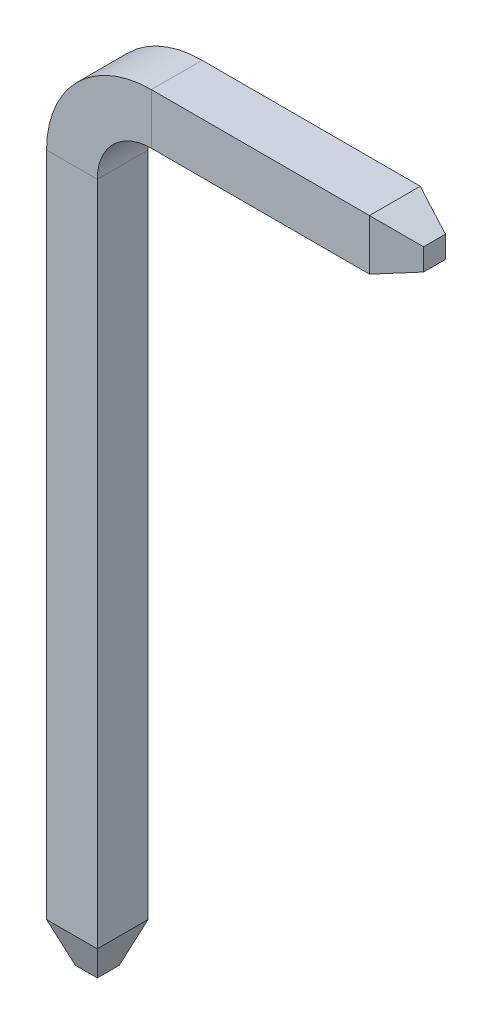
ISO-10303-21;
HEADER;
FILE_DESCRIPTION(('STEP AP214'),'2;1');
FILE_NAME('part.step','',(''),(''),'','','');
FILE_SCHEMA(('AUTOMOTIVE_DESIGN { 1 0 10303 214 1 1 1 1 }'));
ENDSEC;
DATA;
#1=APPLICATION_CONTEXT('core data for automotive mechanical design processes');
#2=APPLICATION_PROTOCOL_DEFINITION('international standard','automotive_design',2000,#1);
#3=PRODUCT_CONTEXT('',#1,'mechanical');
#4=PRODUCT('Part','Part','',(#3));
#5=PRODUCT_RELATED_PRODUCT_CATEGORY('part','',(#4));
#6=PRODUCT_DEFINITION_FORMATION('','',#4);
#7=PRODUCT_DEFINITION_CONTEXT('part definition',#1,'design');
#8=PRODUCT_DEFINITION('design','',#6,#7);
#9=PRODUCT_DEFINITION_SHAPE('','',#8);
#10=(LENGTH_UNIT() NAMED_UNIT(*) SI_UNIT(.MILLI.,.METRE.));
#11=(NAMED_UNIT(*) PLANE_ANGLE_UNIT() SI_UNIT($,.RADIAN.));
#12=(NAMED_UNIT(*) SI_UNIT($,.STERADIAN.) SOLID_ANGLE_UNIT());
#13=UNCERTAINTY_MEASURE_WITH_UNIT(LENGTH_MEASURE(1.E-05),#10,'distance_accuracy_value','');
#14=(GEOMETRIC_REPRESENTATION_CONTEXT(3) GLOBAL_UNCERTAINTY_ASSIGNED_CONTEXT((#13)) GLOBAL_UNIT_ASSIGNED_CONTEXT((#10,
#11,#12)) REPRESENTATION_CONTEXT('',''));
#15=CARTESIAN_POINT('',(0.,0.,0.));
#16=DIRECTION('',(0.,0.,1.));
#17=DIRECTION('',(1.,0.,0.));
#18=AXIS2_PLACEMENT_3D('',#15,#16,#17);
#19=CARTESIAN_POINT('',(0.,-7.25,0.));
#20=DIRECTION('',(0.,1.,0.));
#21=DIRECTION('',(0.,0.,1.));
#22=AXIS2_PLACEMENT_3D('',#19,#20,#21);
#23=PLANE('',#22);
#24=DIRECTION('',(0.,0.,-1.));
#25=VECTOR('',#24,1.);
#26=CARTESIAN_POINT('',(-0.138014882866899,-7.25,-0.32));
#27=LINE('',#26,#25);
#28=CARTESIAN_POINT('',(-0.138014882866899,-7.25,0.1380148828669));
#29=VERTEX_POINT('',#28);
#30=CARTESIAN_POINT('',(-0.138014882866899,-7.25,-0.1380148828669));
#31=VERTEX_POINT('',#30);
#32=EDGE_CURVE('E232',#29,#31,#27,.T.);
#33=ORIENTED_EDGE('',*,*,#32,.T.);
#34=DIRECTION('',(1.,0.,0.));
#35=VECTOR('',#34,1.);
#36=CARTESIAN_POINT('',(0.320000000000001,-7.25,-0.1380148828669));
#37=LINE('',#36,#35);
#38=CARTESIAN_POINT('',(0.138014882866901,-7.25,-0.1380148828669));
#39=VERTEX_POINT('',#38);
#40=EDGE_CURVE('E234',#31,#39,#37,.T.);
#41=ORIENTED_EDGE('',*,*,#40,.T.);
#42=DIRECTION('',(0.,0.,1.));
#43=VECTOR('',#42,1.);
#44=CARTESIAN_POINT('',(0.138014882866901,-7.25,0.32));
#45=LINE('',#44,#43);
#46=CARTESIAN_POINT('',(0.138014882866901,-7.25,0.1380148828669));
#47=VERTEX_POINT('',#46);
#48=EDGE_CURVE('E228',#39,#47,#45,.T.);
#49=ORIENTED_EDGE('',*,*,#48,.T.);
#50=DIRECTION('',(-1.,0.,0.));
#51=VECTOR('',#50,1.);
#52=CARTESIAN_POINT('',(-0.319999999999999,-7.25,0.1380148828669));
#53=LINE('',#52,#51);
#54=EDGE_CURVE('E230',#47,#29,#53,.T.);
#55=ORIENTED_EDGE('',*,*,#54,.T.);
#56=EDGE_LOOP('',(#33,#41,#49,#55));
#57=FACE_BOUND('',#56,.T.);
#58=ADVANCED_FACE('F36',(#57),#23,.F.);
#59=CARTESIAN_POINT('',(4.25,2.65,0.));
#60=DIRECTION('',(1.,0.,0.));
#61=DIRECTION('',(0.,0.,1.));
#62=AXIS2_PLACEMENT_3D('',#59,#60,#61);
#63=PLANE('',#62);
#64=DIRECTION('',(0.,0.,1.));
#65=VECTOR('',#64,1.);
#66=CARTESIAN_POINT('',(4.25,2.7880148828669,0.));
#67=LINE('',#66,#65);
#68=CARTESIAN_POINT('',(4.25,2.7880148828669,-0.1380148828669));
#69=VERTEX_POINT('',#68);
#70=CARTESIAN_POINT('',(4.25,2.7880148828669,0.1380148828669));
#71=VERTEX_POINT('',#70);
#72=EDGE_CURVE('E204',#69,#71,#67,.T.);
#73=ORIENTED_EDGE('',*,*,#72,.T.);
#74=DIRECTION('',(0.,-1.,0.));
#75=VECTOR('',#74,1.);
#76=CARTESIAN_POINT('',(4.25,2.65,0.1380148828669));
#77=LINE('',#76,#75);
#78=CARTESIAN_POINT('',(4.25,2.5119851171331,0.1380148828669));
#79=VERTEX_POINT('',#78);
#80=EDGE_CURVE('E206',#71,#79,#77,.T.);
#81=ORIENTED_EDGE('',*,*,#80,.T.);
#82=DIRECTION('',(0.,0.,-1.));
#83=VECTOR('',#82,1.);
#84=CARTESIAN_POINT('',(4.25,2.5119851171331,0.));
#85=LINE('',#84,#83);
#86=CARTESIAN_POINT('',(4.25,2.5119851171331,-0.1380148828669));
#87=VERTEX_POINT('',#86);
#88=EDGE_CURVE('E197',#79,#87,#85,.T.);
#89=ORIENTED_EDGE('',*,*,#88,.T.);
#90=DIRECTION('',(0.,1.,0.));
#91=VECTOR('',#90,1.);
#92=CARTESIAN_POINT('',(4.25,2.65,-0.1380148828669));
#93=LINE('',#92,#91);
#94=EDGE_CURVE('E202',#87,#69,#93,.T.);
#95=ORIENTED_EDGE('',*,*,#94,.T.);
#96=EDGE_LOOP('',(#73,#81,#89,#95));
#97=FACE_BOUND('',#96,.T.);
#98=ADVANCED_FACE('F289',(#97),#63,.T.);
#99=CARTESIAN_POINT('',(-0.319999999999999,-7.25,-0.32));
#100=DIRECTION('',(-1.,0.,0.));
#101=DIRECTION('',(0.,-1.,0.));
#102=AXIS2_PLACEMENT_3D('',#99,#100,#101);
#103=PLANE('',#102);
#104=DIRECTION('',(0.,1.,0.));
#105=VECTOR('',#104,1.);
#106=CARTESIAN_POINT('',(-0.319999999999999,-7.25,-0.32));
#107=LINE('',#106,#105);
#108=CARTESIAN_POINT('',(-0.319999999999999,-6.75,-0.32));
#109=VERTEX_POINT('',#108);
#110=CARTESIAN_POINT('',(-0.32,1.64999999999999,-0.32));
#111=VERTEX_POINT('',#110);
#112=EDGE_CURVE('E127',#109,#111,#107,.T.);
#113=ORIENTED_EDGE('',*,*,#112,.F.);
#114=DIRECTION('',(0.,0.,1.));
#115=VECTOR('',#114,1.);
#116=CARTESIAN_POINT('',(-0.319999999999999,-6.75,0.32));
#117=LINE('',#116,#115);
#118=CARTESIAN_POINT('',(-0.319999999999999,-6.75,0.32));
#119=VERTEX_POINT('',#118);
#120=EDGE_CURVE('E61',#109,#119,#117,.T.);
#121=ORIENTED_EDGE('',*,*,#120,.T.);
#122=DIRECTION('',(0.,1.,0.));
#123=VECTOR('',#122,1.);
#124=CARTESIAN_POINT('',(-0.319999999999999,-7.25,0.32));
#125=LINE('',#124,#123);
#126=CARTESIAN_POINT('',(-0.32,1.64999999999999,0.32));
#127=VERTEX_POINT('',#126);
#128=EDGE_CURVE('E137',#119,#127,#125,.T.);
#129=ORIENTED_EDGE('',*,*,#128,.T.);
#130=DIRECTION('',(0.,0.,1.));
#131=VECTOR('',#130,1.);
#132=CARTESIAN_POINT('',(-0.32,1.64999999999999,-0.32));
#133=LINE('',#132,#131);
#134=EDGE_CURVE('E147',#111,#127,#133,.T.);
#135=ORIENTED_EDGE('',*,*,#134,.F.);
#136=EDGE_LOOP('',(#113,#121,#129,#135));
#137=FACE_BOUND('',#136,.T.);
#138=ADVANCED_FACE('F159',(#137),#103,.T.);
#139=CARTESIAN_POINT('',(-0.319999999999999,-7.25,0.32));
#140=DIRECTION('',(0.,0.,1.));
#141=DIRECTION('',(1.,0.,0.));
#142=AXIS2_PLACEMENT_3D('',#139,#140,#141);
#143=PLANE('',#142);
#144=ORIENTED_EDGE('',*,*,#128,.F.);
#145=DIRECTION('',(1.,0.,0.));
#146=VECTOR('',#145,1.);
#147=CARTESIAN_POINT('',(0.320000000000001,-6.75,0.32));
#148=LINE('',#147,#146);
#149=CARTESIAN_POINT('',(0.320000000000001,-6.75,0.32));
#150=VERTEX_POINT('',#149);
#151=EDGE_CURVE('E46',#119,#150,#148,.T.);
#152=ORIENTED_EDGE('',*,*,#151,.T.);
#153=DIRECTION('',(0.,1.,0.));
#154=VECTOR('',#153,1.);
#155=CARTESIAN_POINT('',(0.320000000000001,-7.25,0.32));
#156=LINE('',#155,#154);
#157=CARTESIAN_POINT('',(0.32,1.64999999999999,0.32));
#158=VERTEX_POINT('',#157);
#159=EDGE_CURVE('E166',#150,#158,#156,.T.);
#160=ORIENTED_EDGE('',*,*,#159,.T.);
#161=DIRECTION('',(1.,0.,0.));
#162=VECTOR('',#161,1.);
#163=CARTESIAN_POINT('',(-0.32,1.64999999999999,0.32));
#164=LINE('',#163,#162);
#165=EDGE_CURVE('E161',#127,#158,#164,.T.);
#166=ORIENTED_EDGE('',*,*,#165,.F.);
#167=EDGE_LOOP('',(#144,#152,#160,#166));
#168=FACE_BOUND('',#167,.T.);
#169=ADVANCED_FACE('F360',(#168),#143,.T.);
#170=CARTESIAN_POINT('',(0.320000000000001,-7.25,-0.32));
#171=DIRECTION('',(1.,0.,0.));
#172=DIRECTION('',(0.,1.,0.));
#173=AXIS2_PLACEMENT_3D('',#170,#171,#172);
#174=PLANE('',#173);
#175=ORIENTED_EDGE('',*,*,#159,.F.);
#176=DIRECTION('',(0.,0.,-1.));
#177=VECTOR('',#176,1.);
#178=CARTESIAN_POINT('',(0.320000000000001,-6.75,-0.32));
#179=LINE('',#178,#177);
#180=CARTESIAN_POINT('',(0.320000000000001,-6.75,-0.32));
#181=VERTEX_POINT('',#180);
#182=EDGE_CURVE('E11',#150,#181,#179,.T.);
#183=ORIENTED_EDGE('',*,*,#182,.T.);
#184=DIRECTION('',(0.,1.,0.));
#185=VECTOR('',#184,1.);
#186=CARTESIAN_POINT('',(0.320000000000001,-7.25,-0.32));
#187=LINE('',#186,#185);
#188=CARTESIAN_POINT('',(0.32,1.64999999999999,-0.32));
#189=VERTEX_POINT('',#188);
#190=EDGE_CURVE('E162',#181,#189,#187,.T.);
#191=ORIENTED_EDGE('',*,*,#190,.T.);
#192=DIRECTION('',(0.,0.,-1.));
#193=VECTOR('',#192,1.);
#194=CARTESIAN_POINT('',(0.32,1.64999999999999,-0.32));
#195=LINE('',#194,#193);
#196=EDGE_CURVE('E157',#158,#189,#195,.T.);
#197=ORIENTED_EDGE('',*,*,#196,.F.);
#198=EDGE_LOOP('',(#175,#183,#191,#197));
#199=FACE_BOUND('',#198,.T.);
#200=ADVANCED_FACE('F363',(#199),#174,.T.);
#201=CARTESIAN_POINT('',(-0.319999999999999,-7.25,-0.32));
#202=DIRECTION('',(0.,0.,-1.));
#203=DIRECTION('',(-1.,0.,0.));
#204=AXIS2_PLACEMENT_3D('',#201,#202,#203);
#205=PLANE('',#204);
#206=ORIENTED_EDGE('',*,*,#190,.F.);
#207=DIRECTION('',(-1.,0.,0.));
#208=VECTOR('',#207,1.);
#209=CARTESIAN_POINT('',(-0.319999999999999,-6.75,-0.32));
#210=LINE('',#209,#208);
#211=EDGE_CURVE('E135',#181,#109,#210,.T.);
#212=ORIENTED_EDGE('',*,*,#211,.T.);
#213=ORIENTED_EDGE('',*,*,#112,.T.);
#214=DIRECTION('',(-1.,0.,0.));
#215=VECTOR('',#214,1.);
#216=CARTESIAN_POINT('',(-0.32,1.64999999999999,-0.32));
#217=LINE('',#216,#215);
#218=EDGE_CURVE('E132',#189,#111,#217,.T.);
#219=ORIENTED_EDGE('',*,*,#218,.F.);
#220=EDGE_LOOP('',(#206,#212,#213,#219));
#221=FACE_BOUND('',#220,.T.);
#222=ADVANCED_FACE('F130',(#221),#205,.T.);
#223=CARTESIAN_POINT('',(1.,1.65,0.));
#224=DIRECTION('',(0.,0.,-1.));
#225=DIRECTION('',(-1.,0.,0.));
#226=AXIS2_PLACEMENT_3D('',#223,#224,#225);
#227=CYLINDRICAL_SURFACE('',#226,1.32);
#228=CARTESIAN_POINT('',(1.,1.65,0.32));
#229=DIRECTION('',(0.,0.,-1.));
#230=DIRECTION('',(-1.,0.,0.));
#231=AXIS2_PLACEMENT_3D('',#228,#229,#230);
#232=CIRCLE('',#231,1.32);
#233=CARTESIAN_POINT('',(1.00000000000001,2.97,0.32));
#234=VERTEX_POINT('',#233);
#235=EDGE_CURVE('E171',#127,#234,#232,.T.);
#236=ORIENTED_EDGE('',*,*,#235,.T.);
#237=DIRECTION('',(0.,0.,1.));
#238=VECTOR('',#237,1.);
#239=CARTESIAN_POINT('',(1.00000000000001,2.97,-0.32));
#240=LINE('',#239,#238);
#241=CARTESIAN_POINT('',(1.00000000000001,2.97,-0.32));
#242=VERTEX_POINT('',#241);
#243=EDGE_CURVE('E149',#242,#234,#240,.T.);
#244=ORIENTED_EDGE('',*,*,#243,.F.);
#245=CARTESIAN_POINT('',(1.,1.65,-0.32));
#246=DIRECTION('',(0.,0.,-1.));
#247=DIRECTION('',(-1.,0.,0.));
#248=AXIS2_PLACEMENT_3D('',#245,#246,#247);
#249=CIRCLE('',#248,1.32);
#250=EDGE_CURVE('E144',#111,#242,#249,.T.);
#251=ORIENTED_EDGE('',*,*,#250,.F.);
#252=ORIENTED_EDGE('',*,*,#134,.T.);
#253=EDGE_LOOP('',(#236,#244,#251,#252));
#254=FACE_BOUND('',#253,.T.);
#255=ADVANCED_FACE('F146',(#254),#227,.T.);
#256=CARTESIAN_POINT('',(-0.32,1.64999999999999,0.32));
#257=DIRECTION('',(0.,0.,1.));
#258=DIRECTION('',(1.,0.,0.));
#259=AXIS2_PLACEMENT_3D('',#256,#257,#258);
#260=PLANE('',#259);
#261=CARTESIAN_POINT('',(1.,1.65,0.32));
#262=DIRECTION('',(0.,0.,-1.));
#263=DIRECTION('',(-1.,0.,0.));
#264=AXIS2_PLACEMENT_3D('',#261,#262,#263);
#265=CIRCLE('',#264,0.68);
#266=CARTESIAN_POINT('',(1.,2.33,0.32));
#267=VERTEX_POINT('',#266);
#268=EDGE_CURVE('E185',#158,#267,#265,.T.);
#269=ORIENTED_EDGE('',*,*,#268,.T.);
#270=DIRECTION('',(0.,-1.,0.));
#271=VECTOR('',#270,1.);
#272=CARTESIAN_POINT('',(1.00000000000001,2.97,0.32));
#273=LINE('',#272,#271);
#274=EDGE_CURVE('E172',#234,#267,#273,.T.);
#275=ORIENTED_EDGE('',*,*,#274,.F.);
#276=ORIENTED_EDGE('',*,*,#235,.F.);
#277=ORIENTED_EDGE('',*,*,#165,.T.);
#278=EDGE_LOOP('',(#269,#275,#276,#277));
#279=FACE_BOUND('',#278,.T.);
#280=ADVANCED_FACE('F344',(#279),#260,.T.);
#281=CARTESIAN_POINT('',(1.,1.65,0.));
#282=DIRECTION('',(0.,0.,-1.));
#283=DIRECTION('',(-1.,0.,0.));
#284=AXIS2_PLACEMENT_3D('',#281,#282,#283);
#285=CYLINDRICAL_SURFACE('',#284,0.68);
#286=CARTESIAN_POINT('',(1.,1.65,-0.32));
#287=DIRECTION('',(0.,0.,-1.));
#288=DIRECTION('',(-1.,0.,0.));
#289=AXIS2_PLACEMENT_3D('',#286,#287,#288);
#290=CIRCLE('',#289,0.68);
#291=CARTESIAN_POINT('',(1.,2.33,-0.32));
#292=VERTEX_POINT('',#291);
#293=EDGE_CURVE('E156',#189,#292,#290,.T.);
#294=ORIENTED_EDGE('',*,*,#293,.T.);
#295=DIRECTION('',(0.,0.,-1.));
#296=VECTOR('',#295,1.);
#297=CARTESIAN_POINT('',(1.,2.33,-0.32));
#298=LINE('',#297,#296);
#299=EDGE_CURVE('E188',#267,#292,#298,.T.);
#300=ORIENTED_EDGE('',*,*,#299,.F.);
#301=ORIENTED_EDGE('',*,*,#268,.F.);
#302=ORIENTED_EDGE('',*,*,#196,.T.);
#303=EDGE_LOOP('',(#294,#300,#301,#302));
#304=FACE_BOUND('',#303,.T.);
#305=ADVANCED_FACE('F340',(#304),#285,.F.);
#306=CARTESIAN_POINT('',(-0.32,1.64999999999999,-0.32));
#307=DIRECTION('',(0.,0.,-1.));
#308=DIRECTION('',(-1.,0.,0.));
#309=AXIS2_PLACEMENT_3D('',#306,#307,#308);
#310=PLANE('',#309);
#311=DIRECTION('',(0.,1.,0.));
#312=VECTOR('',#311,1.);
#313=CARTESIAN_POINT('',(1.00000000000001,2.97,-0.32));
#314=LINE('',#313,#312);
#315=EDGE_CURVE('E180',#292,#242,#314,.T.);
#316=ORIENTED_EDGE('',*,*,#315,.F.);
#317=ORIENTED_EDGE('',*,*,#293,.F.);
#318=ORIENTED_EDGE('',*,*,#218,.T.);
#319=ORIENTED_EDGE('',*,*,#250,.T.);
#320=EDGE_LOOP('',(#316,#317,#318,#319));
#321=FACE_BOUND('',#320,.T.);
#322=ADVANCED_FACE('F154',(#321),#310,.T.);
#323=CARTESIAN_POINT('',(1.00000000000001,2.97,-0.32));
#324=DIRECTION('',(0.,1.,0.));
#325=DIRECTION('',(0.,0.,1.));
#326=AXIS2_PLACEMENT_3D('',#323,#324,#325);
#327=PLANE('',#326);
#328=DIRECTION('',(1.,0.,0.));
#329=VECTOR('',#328,1.);
#330=CARTESIAN_POINT('',(1.00000000000001,2.97,0.32));
#331=LINE('',#330,#329);
#332=CARTESIAN_POINT('',(3.74999999999999,2.97,0.32));
#333=VERTEX_POINT('',#332);
#334=EDGE_CURVE('E174',#234,#333,#331,.T.);
#335=ORIENTED_EDGE('',*,*,#334,.T.);
#336=DIRECTION('',(0.,0.,-1.));
#337=VECTOR('',#336,1.);
#338=CARTESIAN_POINT('',(3.75,2.97,-0.32));
#339=LINE('',#338,#337);
#340=CARTESIAN_POINT('',(3.74999999999999,2.97,-0.32));
#341=VERTEX_POINT('',#340);
#342=EDGE_CURVE('E212',#333,#341,#339,.T.);
#343=ORIENTED_EDGE('',*,*,#342,.T.);
#344=DIRECTION('',(1.,0.,0.));
#345=VECTOR('',#344,1.);
#346=CARTESIAN_POINT('',(1.00000000000001,2.97,-0.32));
#347=LINE('',#346,#345);
#348=EDGE_CURVE('E178',#242,#341,#347,.T.);
#349=ORIENTED_EDGE('',*,*,#348,.F.);
#350=ORIENTED_EDGE('',*,*,#243,.T.);
#351=EDGE_LOOP('',(#335,#343,#349,#350));
#352=FACE_BOUND('',#351,.T.);
#353=ADVANCED_FACE('F349',(#352),#327,.T.);
#354=CARTESIAN_POINT('',(1.00000000000001,2.97,0.32));
#355=DIRECTION('',(0.,0.,1.));
#356=DIRECTION('',(1.,0.,0.));
#357=AXIS2_PLACEMENT_3D('',#354,#355,#356);
#358=PLANE('',#357);
#359=DIRECTION('',(1.,0.,0.));
#360=VECTOR('',#359,1.);
#361=CARTESIAN_POINT('',(1.00000000000001,2.33,0.32));
#362=LINE('',#361,#360);
#363=CARTESIAN_POINT('',(3.74999999999999,2.33,0.32));
#364=VERTEX_POINT('',#363);
#365=EDGE_CURVE('E177',#267,#364,#362,.T.);
#366=ORIENTED_EDGE('',*,*,#365,.T.);
#367=DIRECTION('',(0.,1.,0.));
#368=VECTOR('',#367,1.);
#369=CARTESIAN_POINT('',(3.75,2.97,0.32));
#370=LINE('',#369,#368);
#371=EDGE_CURVE('E209',#364,#333,#370,.T.);
#372=ORIENTED_EDGE('',*,*,#371,.T.);
#373=ORIENTED_EDGE('',*,*,#334,.F.);
#374=ORIENTED_EDGE('',*,*,#274,.T.);
#375=EDGE_LOOP('',(#366,#372,#373,#374));
#376=FACE_BOUND('',#375,.T.);
#377=ADVANCED_FACE('F283',(#376),#358,.T.);
#378=CARTESIAN_POINT('',(1.00000000000001,2.33,-0.32));
#379=DIRECTION('',(0.,-1.,0.));
#380=DIRECTION('',(0.,0.,-1.));
#381=AXIS2_PLACEMENT_3D('',#378,#379,#380);
#382=PLANE('',#381);
#383=DIRECTION('',(1.,0.,0.));
#384=VECTOR('',#383,1.);
#385=CARTESIAN_POINT('',(1.00000000000001,2.33,-0.32));
#386=LINE('',#385,#384);
#387=CARTESIAN_POINT('',(3.74999999999999,2.33,-0.32));
#388=VERTEX_POINT('',#387);
#389=EDGE_CURVE('E191',#292,#388,#386,.T.);
#390=ORIENTED_EDGE('',*,*,#389,.T.);
#391=DIRECTION('',(0.,0.,1.));
#392=VECTOR('',#391,1.);
#393=CARTESIAN_POINT('',(3.75,2.33,-0.32));
#394=LINE('',#393,#392);
#395=EDGE_CURVE('E216',#388,#364,#394,.T.);
#396=ORIENTED_EDGE('',*,*,#395,.T.);
#397=ORIENTED_EDGE('',*,*,#365,.F.);
#398=ORIENTED_EDGE('',*,*,#299,.T.);
#399=EDGE_LOOP('',(#390,#396,#397,#398));
#400=FACE_BOUND('',#399,.T.);
#401=ADVANCED_FACE('F273',(#400),#382,.T.);
#402=CARTESIAN_POINT('',(1.00000000000001,2.97,-0.32));
#403=DIRECTION('',(0.,0.,-1.));
#404=DIRECTION('',(-1.,0.,0.));
#405=AXIS2_PLACEMENT_3D('',#402,#403,#404);
#406=PLANE('',#405);
#407=ORIENTED_EDGE('',*,*,#348,.T.);
#408=DIRECTION('',(0.,-1.,0.));
#409=VECTOR('',#408,1.);
#410=CARTESIAN_POINT('',(3.75,2.97,-0.32));
#411=LINE('',#410,#409);
#412=EDGE_CURVE('E214',#341,#388,#411,.T.);
#413=ORIENTED_EDGE('',*,*,#412,.T.);
#414=ORIENTED_EDGE('',*,*,#389,.F.);
#415=ORIENTED_EDGE('',*,*,#315,.T.);
#416=EDGE_LOOP('',(#407,#413,#414,#415));
#417=FACE_BOUND('',#416,.T.);
#418=ADVANCED_FACE('F270',(#417),#406,.T.);
#419=CARTESIAN_POINT('',(4.25,2.65,-0.1380148828669));
#420=DIRECTION('',(-0.342020143325665,0.,0.93969262078591));
#421=DIRECTION('',(0.,1.,0.));
#422=AXIS2_PLACEMENT_3D('',#419,#420,#421);
#423=PLANE('',#422);
#424=DIRECTION('',(0.88912649071599,0.323615577118182,0.323615577118182));
#425=VECTOR('',#424,1.);
#426=CARTESIAN_POINT('',(4.28971173749895,2.52643900753371,-0.123560992466289));
#427=LINE('',#426,#425);
#428=EDGE_CURVE('E222',#388,#87,#427,.T.);
#429=ORIENTED_EDGE('',*,*,#428,.F.);
#430=ORIENTED_EDGE('',*,*,#412,.F.);
#431=DIRECTION('',(0.88912649071599,-0.323615577118182,0.323615577118182));
#432=VECTOR('',#431,1.);
#433=CARTESIAN_POINT('',(4.28971173749895,2.77356099246629,-0.123560992466289));
#434=LINE('',#433,#432);
#435=EDGE_CURVE('E138',#69,#341,#434,.F.);
#436=ORIENTED_EDGE('',*,*,#435,.F.);
#437=ORIENTED_EDGE('',*,*,#94,.F.);
#438=EDGE_LOOP('',(#429,#430,#436,#437));
#439=FACE_BOUND('',#438,.T.);
#440=ADVANCED_FACE('F272',(#439),#423,.F.);
#441=CARTESIAN_POINT('',(4.25,2.7880148828669,0.));
#442=DIRECTION('',(-0.342020143325665,-0.93969262078591,0.));
#443=DIRECTION('',(0.,0.,1.));
#444=AXIS2_PLACEMENT_3D('',#441,#442,#443);
#445=PLANE('',#444);
#446=ORIENTED_EDGE('',*,*,#435,.T.);
#447=ORIENTED_EDGE('',*,*,#342,.F.);
#448=DIRECTION('',(0.88912649071599,-0.323615577118182,-0.323615577118182));
#449=VECTOR('',#448,1.);
#450=CARTESIAN_POINT('',(4.28971173749895,2.77356099246629,0.123560992466289));
#451=LINE('',#450,#449);
#452=EDGE_CURVE('E220',#71,#333,#451,.F.);
#453=ORIENTED_EDGE('',*,*,#452,.F.);
#454=ORIENTED_EDGE('',*,*,#72,.F.);
#455=EDGE_LOOP('',(#446,#447,#453,#454));
#456=FACE_BOUND('',#455,.T.);
#457=ADVANCED_FACE('F280',(#456),#445,.F.);
#458=CARTESIAN_POINT('',(4.25,2.5119851171331,0.));
#459=DIRECTION('',(-0.342020143325665,0.93969262078591,0.));
#460=DIRECTION('',(0.,0.,-1.));
#461=AXIS2_PLACEMENT_3D('',#458,#459,#460);
#462=PLANE('',#461);
#463=ORIENTED_EDGE('',*,*,#428,.T.);
#464=ORIENTED_EDGE('',*,*,#88,.F.);
#465=DIRECTION('',(-0.88912649071599,-0.323615577118182,0.323615577118182));
#466=VECTOR('',#465,1.);
#467=CARTESIAN_POINT('',(4.28971173749895,2.52643900753371,0.123560992466289));
#468=LINE('',#467,#466);
#469=EDGE_CURVE('E218',#364,#79,#468,.F.);
#470=ORIENTED_EDGE('',*,*,#469,.F.);
#471=ORIENTED_EDGE('',*,*,#395,.F.);
#472=EDGE_LOOP('',(#463,#464,#470,#471));
#473=FACE_BOUND('',#472,.T.);
#474=ADVANCED_FACE('F302',(#473),#462,.F.);
#475=CARTESIAN_POINT('',(4.25,2.65,0.1380148828669));
#476=DIRECTION('',(-0.342020143325665,0.,-0.93969262078591));
#477=DIRECTION('',(0.,-1.,0.));
#478=AXIS2_PLACEMENT_3D('',#475,#476,#477);
#479=PLANE('',#478);
#480=ORIENTED_EDGE('',*,*,#452,.T.);
#481=ORIENTED_EDGE('',*,*,#371,.F.);
#482=ORIENTED_EDGE('',*,*,#469,.T.);
#483=ORIENTED_EDGE('',*,*,#80,.F.);
#484=EDGE_LOOP('',(#480,#481,#482,#483));
#485=FACE_BOUND('',#484,.T.);
#486=ADVANCED_FACE('F296',(#485),#479,.F.);
#487=CARTESIAN_POINT('',(-0.319999999999999,-6.75,0.32));
#488=DIRECTION('',(0.,-0.342020143325665,0.93969262078591));
#489=DIRECTION('',(-1.,0.,0.));
#490=AXIS2_PLACEMENT_3D('',#487,#488,#489);
#491=PLANE('',#490);
#492=DIRECTION('',(0.323615577118182,-0.88912649071599,-0.323615577118182));
#493=VECTOR('',#492,1.);
#494=CARTESIAN_POINT('',(-0.319999999999999,-6.75,0.32));
#495=LINE('',#494,#493);
#496=EDGE_CURVE('E242',#29,#119,#495,.F.);
#497=ORIENTED_EDGE('',*,*,#496,.F.);
#498=ORIENTED_EDGE('',*,*,#54,.F.);
#499=DIRECTION('',(-0.323615577118182,-0.88912649071599,-0.323615577118182));
#500=VECTOR('',#499,1.);
#501=CARTESIAN_POINT('',(0.252974693277739,-6.93415051675143,0.252974693277738));
#502=LINE('',#501,#500);
#503=EDGE_CURVE('E41',#150,#47,#502,.T.);
#504=ORIENTED_EDGE('',*,*,#503,.F.);
#505=ORIENTED_EDGE('',*,*,#151,.F.);
#506=EDGE_LOOP('',(#497,#498,#504,#505));
#507=FACE_BOUND('',#506,.T.);
#508=ADVANCED_FACE('F39',(#507),#491,.T.);
#509=CARTESIAN_POINT('',(0.320000000000001,-6.75,-0.32));
#510=DIRECTION('',(0.93969262078591,-0.342020143325665,0.));
#511=DIRECTION('',(0.,0.,1.));
#512=AXIS2_PLACEMENT_3D('',#509,#510,#511);
#513=PLANE('',#512);
#514=ORIENTED_EDGE('',*,*,#503,.T.);
#515=ORIENTED_EDGE('',*,*,#48,.F.);
#516=DIRECTION('',(0.323615577118182,0.88912649071599,-0.323615577118182));
#517=VECTOR('',#516,1.);
#518=CARTESIAN_POINT('',(0.320000000000001,-6.75,-0.32));
#519=LINE('',#518,#517);
#520=EDGE_CURVE('E241',#181,#39,#519,.F.);
#521=ORIENTED_EDGE('',*,*,#520,.F.);
#522=ORIENTED_EDGE('',*,*,#182,.F.);
#523=EDGE_LOOP('',(#514,#515,#521,#522));
#524=FACE_BOUND('',#523,.T.);
#525=ADVANCED_FACE('F252',(#524),#513,.T.);
#526=CARTESIAN_POINT('',(-0.319999999999999,-6.75,-0.32));
#527=DIRECTION('',(-0.93969262078591,-0.342020143325665,0.));
#528=DIRECTION('',(0.,0.,-1.));
#529=AXIS2_PLACEMENT_3D('',#526,#527,#528);
#530=PLANE('',#529);
#531=ORIENTED_EDGE('',*,*,#496,.T.);
#532=ORIENTED_EDGE('',*,*,#120,.F.);
#533=DIRECTION('',(0.323615577118182,-0.88912649071599,0.323615577118182));
#534=VECTOR('',#533,1.);
#535=CARTESIAN_POINT('',(-0.319999999999999,-6.75,-0.32));
#536=LINE('',#535,#534);
#537=EDGE_CURVE('E239',#31,#109,#536,.F.);
#538=ORIENTED_EDGE('',*,*,#537,.F.);
#539=ORIENTED_EDGE('',*,*,#32,.F.);
#540=EDGE_LOOP('',(#531,#532,#538,#539));
#541=FACE_BOUND('',#540,.T.);
#542=ADVANCED_FACE('F261',(#541),#530,.T.);
#543=CARTESIAN_POINT('',(-0.319999999999999,-6.75,-0.32));
#544=DIRECTION('',(0.,-0.342020143325665,-0.93969262078591));
#545=DIRECTION('',(1.,0.,0.));
#546=AXIS2_PLACEMENT_3D('',#543,#544,#545);
#547=PLANE('',#546);
#548=ORIENTED_EDGE('',*,*,#520,.T.);
#549=ORIENTED_EDGE('',*,*,#40,.F.);
#550=ORIENTED_EDGE('',*,*,#537,.T.);
#551=ORIENTED_EDGE('',*,*,#211,.F.);
#552=EDGE_LOOP('',(#548,#549,#550,#551));
#553=FACE_BOUND('',#552,.T.);
#554=ADVANCED_FACE('F260',(#553),#547,.T.);
#555=CLOSED_SHELL('',(#58,#98,#138,#169,#200,#222,#255,#280,#305,#322,#353,#377,#401,#418,#440,
#457,#474,#486,#508,#525,#542,#554));
#556=MANIFOLD_SOLID_BREP('B2',#555);
#557=ADVANCED_BREP_SHAPE_REPRESENTATION('',(#18,#556),#14);
#558=SHAPE_DEFINITION_REPRESENTATION(#9,#557);
ENDSEC;
END-ISO-10303-21;
